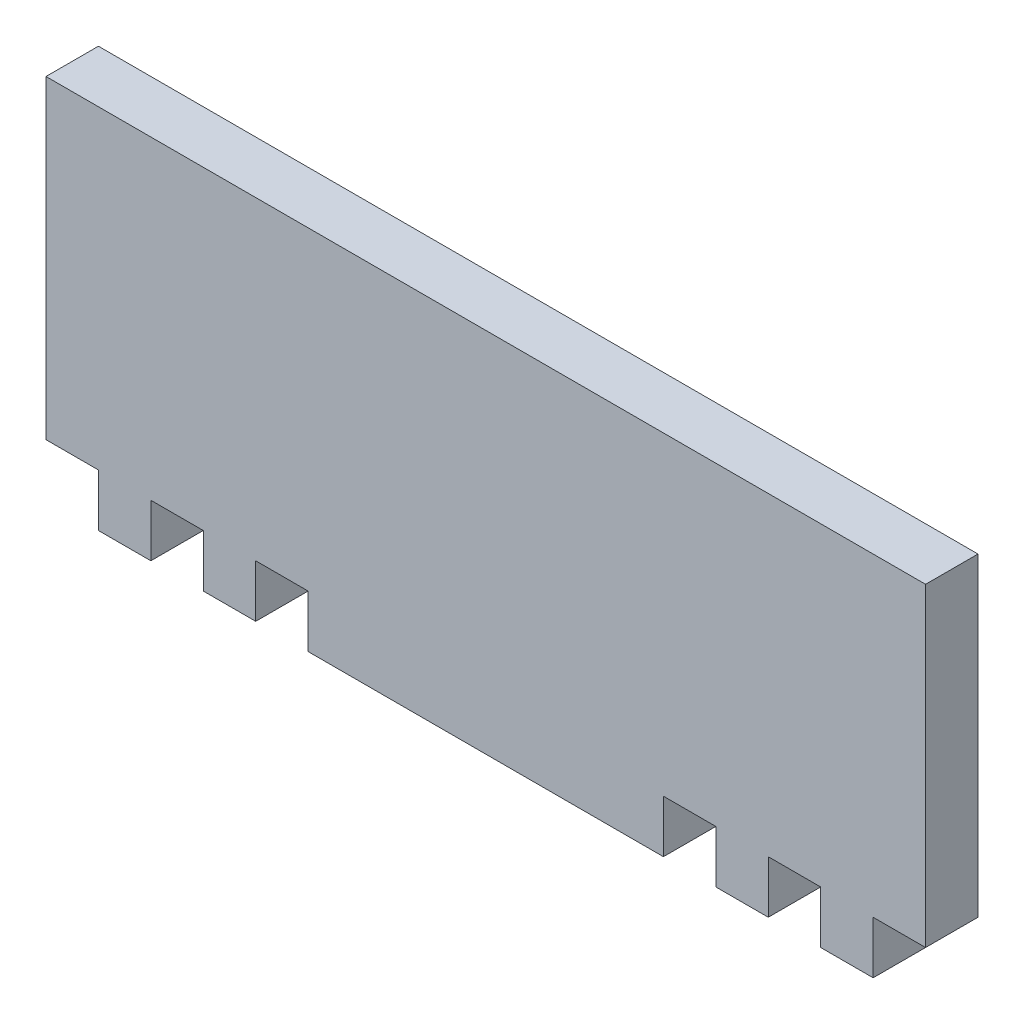
ISO-10303-21;
HEADER;
FILE_DESCRIPTION(('STEP AP214'),'2;1');
FILE_NAME('part.step','',(''),(''),'','','');
FILE_SCHEMA(('AUTOMOTIVE_DESIGN { 1 0 10303 214 1 1 1 1 }'));
ENDSEC;
DATA;
#1=APPLICATION_CONTEXT('core data for automotive mechanical design processes');
#2=APPLICATION_PROTOCOL_DEFINITION('international standard','automotive_design',2000,#1);
#3=PRODUCT_CONTEXT('',#1,'mechanical');
#4=PRODUCT('Part','Part','',(#3));
#5=PRODUCT_RELATED_PRODUCT_CATEGORY('part','',(#4));
#6=PRODUCT_DEFINITION_FORMATION('','',#4);
#7=PRODUCT_DEFINITION_CONTEXT('part definition',#1,'design');
#8=PRODUCT_DEFINITION('design','',#6,#7);
#9=PRODUCT_DEFINITION_SHAPE('','',#8);
#10=(LENGTH_UNIT() NAMED_UNIT(*) SI_UNIT(.MILLI.,.METRE.));
#11=(NAMED_UNIT(*) PLANE_ANGLE_UNIT() SI_UNIT($,.RADIAN.));
#12=(NAMED_UNIT(*) SI_UNIT($,.STERADIAN.) SOLID_ANGLE_UNIT());
#13=UNCERTAINTY_MEASURE_WITH_UNIT(LENGTH_MEASURE(1.E-05),#10,'distance_accuracy_value','');
#14=(GEOMETRIC_REPRESENTATION_CONTEXT(3) GLOBAL_UNCERTAINTY_ASSIGNED_CONTEXT((#13)) GLOBAL_UNIT_ASSIGNED_CONTEXT((#10,
#11,#12)) REPRESENTATION_CONTEXT('',''));
#15=CARTESIAN_POINT('',(0.,0.,0.));
#16=DIRECTION('',(0.,0.,1.));
#17=DIRECTION('',(1.,0.,0.));
#18=AXIS2_PLACEMENT_3D('',#15,#16,#17);
#19=CARTESIAN_POINT('',(-95.7657407799199,79.2291150803207,5.));
#20=DIRECTION('',(1.,0.,0.));
#21=DIRECTION('',(0.,0.,-1.));
#22=AXIS2_PLACEMENT_3D('',#19,#20,#21);
#23=PLANE('',#22);
#24=DIRECTION('',(0.,-1.,0.));
#25=VECTOR('',#24,1.);
#26=CARTESIAN_POINT('',(-95.7657407799199,79.2291150803207,0.));
#27=LINE('',#26,#25);
#28=CARTESIAN_POINT('',(-95.7657407799199,79.2291150803207,0.));
#29=VERTEX_POINT('',#28);
#30=CARTESIAN_POINT('',(-95.7657407799199,49.2291150803207,0.));
#31=VERTEX_POINT('',#30);
#32=EDGE_CURVE('E225',#29,#31,#27,.T.);
#33=ORIENTED_EDGE('',*,*,#32,.T.);
#34=DIRECTION('',(0.,0.,-1.));
#35=VECTOR('',#34,1.);
#36=CARTESIAN_POINT('',(-95.7657407799199,49.2291150803207,5.));
#37=LINE('',#36,#35);
#38=CARTESIAN_POINT('',(-95.7657407799199,49.2291150803207,5.));
#39=VERTEX_POINT('',#38);
#40=EDGE_CURVE('E11',#39,#31,#37,.T.);
#41=ORIENTED_EDGE('',*,*,#40,.F.);
#42=DIRECTION('',(0.,-1.,0.));
#43=VECTOR('',#42,1.);
#44=CARTESIAN_POINT('',(-95.7657407799199,79.2291150803207,5.));
#45=LINE('',#44,#43);
#46=CARTESIAN_POINT('',(-95.7657407799199,79.2291150803207,5.));
#47=VERTEX_POINT('',#46);
#48=EDGE_CURVE('E271',#47,#39,#45,.T.);
#49=ORIENTED_EDGE('',*,*,#48,.F.);
#50=DIRECTION('',(0.,0.,-1.));
#51=VECTOR('',#50,1.);
#52=CARTESIAN_POINT('',(-95.7657407799199,79.2291150803207,5.));
#53=LINE('',#52,#51);
#54=EDGE_CURVE('E221',#47,#29,#53,.T.);
#55=ORIENTED_EDGE('',*,*,#54,.T.);
#56=EDGE_LOOP('',(#33,#41,#49,#55));
#57=FACE_BOUND('',#56,.T.);
#58=ADVANCED_FACE('F33',(#57),#23,.F.);
#59=CARTESIAN_POINT('',(-95.7657407799199,49.2291150803207,5.));
#60=DIRECTION('',(0.,1.,0.));
#61=DIRECTION('',(0.,0.,1.));
#62=AXIS2_PLACEMENT_3D('',#59,#60,#61);
#63=PLANE('',#62);
#64=DIRECTION('',(1.,0.,0.));
#65=VECTOR('',#64,1.);
#66=CARTESIAN_POINT('',(-95.7657407799199,49.2291150803207,0.));
#67=LINE('',#66,#65);
#68=CARTESIAN_POINT('',(-90.7657407799199,49.2291150803207,0.));
#69=VERTEX_POINT('',#68);
#70=EDGE_CURVE('E228',#31,#69,#67,.T.);
#71=ORIENTED_EDGE('',*,*,#70,.T.);
#72=DIRECTION('',(0.,0.,-1.));
#73=VECTOR('',#72,1.);
#74=CARTESIAN_POINT('',(-90.7657407799199,49.2291150803207,5.));
#75=LINE('',#74,#73);
#76=CARTESIAN_POINT('',(-90.7657407799199,49.2291150803207,5.));
#77=VERTEX_POINT('',#76);
#78=EDGE_CURVE('E41',#77,#69,#75,.T.);
#79=ORIENTED_EDGE('',*,*,#78,.F.);
#80=DIRECTION('',(1.,0.,0.));
#81=VECTOR('',#80,1.);
#82=CARTESIAN_POINT('',(-95.7657407799199,49.2291150803207,5.));
#83=LINE('',#82,#81);
#84=EDGE_CURVE('E140',#39,#77,#83,.T.);
#85=ORIENTED_EDGE('',*,*,#84,.F.);
#86=ORIENTED_EDGE('',*,*,#40,.T.);
#87=EDGE_LOOP('',(#71,#79,#85,#86));
#88=FACE_BOUND('',#87,.T.);
#89=ADVANCED_FACE('F409',(#88),#63,.F.);
#90=CARTESIAN_POINT('',(-90.7657407799199,49.2291150803207,5.));
#91=DIRECTION('',(1.,0.,0.));
#92=DIRECTION('',(0.,0.,-1.));
#93=AXIS2_PLACEMENT_3D('',#90,#91,#92);
#94=PLANE('',#93);
#95=DIRECTION('',(0.,-1.,0.));
#96=VECTOR('',#95,1.);
#97=CARTESIAN_POINT('',(-90.7657407799199,49.2291150803207,0.));
#98=LINE('',#97,#96);
#99=CARTESIAN_POINT('',(-90.7657407799199,44.2291150803207,0.));
#100=VERTEX_POINT('',#99);
#101=EDGE_CURVE('E230',#69,#100,#98,.T.);
#102=ORIENTED_EDGE('',*,*,#101,.T.);
#103=DIRECTION('',(0.,0.,-1.));
#104=VECTOR('',#103,1.);
#105=CARTESIAN_POINT('',(-90.7657407799199,44.2291150803207,5.));
#106=LINE('',#105,#104);
#107=CARTESIAN_POINT('',(-90.7657407799199,44.2291150803207,5.));
#108=VERTEX_POINT('',#107);
#109=EDGE_CURVE('E326',#108,#100,#106,.T.);
#110=ORIENTED_EDGE('',*,*,#109,.F.);
#111=DIRECTION('',(0.,-1.,0.));
#112=VECTOR('',#111,1.);
#113=CARTESIAN_POINT('',(-90.7657407799199,49.2291150803207,5.));
#114=LINE('',#113,#112);
#115=EDGE_CURVE('E334',#77,#108,#114,.T.);
#116=ORIENTED_EDGE('',*,*,#115,.F.);
#117=ORIENTED_EDGE('',*,*,#78,.T.);
#118=EDGE_LOOP('',(#102,#110,#116,#117));
#119=FACE_BOUND('',#118,.T.);
#120=ADVANCED_FACE('F332',(#119),#94,.F.);
#121=CARTESIAN_POINT('',(-90.7657407799199,44.2291150803207,5.));
#122=DIRECTION('',(0.,1.,0.));
#123=DIRECTION('',(0.,0.,1.));
#124=AXIS2_PLACEMENT_3D('',#121,#122,#123);
#125=PLANE('',#124);
#126=DIRECTION('',(1.,0.,0.));
#127=VECTOR('',#126,1.);
#128=CARTESIAN_POINT('',(-90.7657407799199,44.2291150803207,0.));
#129=LINE('',#128,#127);
#130=CARTESIAN_POINT('',(-85.7657407799199,44.2291150803207,0.));
#131=VERTEX_POINT('',#130);
#132=EDGE_CURVE('E232',#100,#131,#129,.T.);
#133=ORIENTED_EDGE('',*,*,#132,.T.);
#134=DIRECTION('',(0.,0.,-1.));
#135=VECTOR('',#134,1.);
#136=CARTESIAN_POINT('',(-85.7657407799199,44.2291150803207,5.));
#137=LINE('',#136,#135);
#138=CARTESIAN_POINT('',(-85.7657407799199,44.2291150803207,5.));
#139=VERTEX_POINT('',#138);
#140=EDGE_CURVE('E323',#139,#131,#137,.T.);
#141=ORIENTED_EDGE('',*,*,#140,.F.);
#142=DIRECTION('',(1.,0.,0.));
#143=VECTOR('',#142,1.);
#144=CARTESIAN_POINT('',(-90.7657407799199,44.2291150803207,5.));
#145=LINE('',#144,#143);
#146=EDGE_CURVE('E352',#108,#139,#145,.T.);
#147=ORIENTED_EDGE('',*,*,#146,.F.);
#148=ORIENTED_EDGE('',*,*,#109,.T.);
#149=EDGE_LOOP('',(#133,#141,#147,#148));
#150=FACE_BOUND('',#149,.T.);
#151=ADVANCED_FACE('F343',(#150),#125,.F.);
#152=CARTESIAN_POINT('',(-85.7657407799199,44.2291150803207,5.));
#153=DIRECTION('',(-1.,0.,0.));
#154=DIRECTION('',(0.,0.,1.));
#155=AXIS2_PLACEMENT_3D('',#152,#153,#154);
#156=PLANE('',#155);
#157=DIRECTION('',(0.,1.,0.));
#158=VECTOR('',#157,1.);
#159=CARTESIAN_POINT('',(-85.7657407799199,44.2291150803207,0.));
#160=LINE('',#159,#158);
#161=CARTESIAN_POINT('',(-85.7657407799199,49.2291150803207,0.));
#162=VERTEX_POINT('',#161);
#163=EDGE_CURVE('E234',#131,#162,#160,.T.);
#164=ORIENTED_EDGE('',*,*,#163,.T.);
#165=DIRECTION('',(0.,0.,-1.));
#166=VECTOR('',#165,1.);
#167=CARTESIAN_POINT('',(-85.7657407799199,49.2291150803207,5.));
#168=LINE('',#167,#166);
#169=CARTESIAN_POINT('',(-85.7657407799199,49.2291150803207,5.));
#170=VERTEX_POINT('',#169);
#171=EDGE_CURVE('E320',#170,#162,#168,.T.);
#172=ORIENTED_EDGE('',*,*,#171,.F.);
#173=DIRECTION('',(0.,1.,0.));
#174=VECTOR('',#173,1.);
#175=CARTESIAN_POINT('',(-85.7657407799199,44.2291150803207,5.));
#176=LINE('',#175,#174);
#177=EDGE_CURVE('E349',#139,#170,#176,.T.);
#178=ORIENTED_EDGE('',*,*,#177,.F.);
#179=ORIENTED_EDGE('',*,*,#140,.T.);
#180=EDGE_LOOP('',(#164,#172,#178,#179));
#181=FACE_BOUND('',#180,.T.);
#182=ADVANCED_FACE('F347',(#181),#156,.F.);
#183=CARTESIAN_POINT('',(-85.7657407799199,49.2291150803207,5.));
#184=DIRECTION('',(0.,1.,0.));
#185=DIRECTION('',(0.,0.,1.));
#186=AXIS2_PLACEMENT_3D('',#183,#184,#185);
#187=PLANE('',#186);
#188=DIRECTION('',(1.,0.,0.));
#189=VECTOR('',#188,1.);
#190=CARTESIAN_POINT('',(-85.7657407799199,49.2291150803207,0.));
#191=LINE('',#190,#189);
#192=CARTESIAN_POINT('',(-80.7657407799199,49.2291150803207,0.));
#193=VERTEX_POINT('',#192);
#194=EDGE_CURVE('E236',#162,#193,#191,.T.);
#195=ORIENTED_EDGE('',*,*,#194,.T.);
#196=DIRECTION('',(0.,0.,-1.));
#197=VECTOR('',#196,1.);
#198=CARTESIAN_POINT('',(-80.7657407799199,49.2291150803207,5.));
#199=LINE('',#198,#197);
#200=CARTESIAN_POINT('',(-80.7657407799199,49.2291150803207,5.));
#201=VERTEX_POINT('',#200);
#202=EDGE_CURVE('E317',#201,#193,#199,.T.);
#203=ORIENTED_EDGE('',*,*,#202,.F.);
#204=DIRECTION('',(1.,0.,0.));
#205=VECTOR('',#204,1.);
#206=CARTESIAN_POINT('',(-85.7657407799199,49.2291150803207,5.));
#207=LINE('',#206,#205);
#208=EDGE_CURVE('E351',#170,#201,#207,.T.);
#209=ORIENTED_EDGE('',*,*,#208,.F.);
#210=ORIENTED_EDGE('',*,*,#171,.T.);
#211=EDGE_LOOP('',(#195,#203,#209,#210));
#212=FACE_BOUND('',#211,.T.);
#213=ADVANCED_FACE('F422',(#212),#187,.F.);
#214=CARTESIAN_POINT('',(-80.7657407799199,49.2291150803207,5.));
#215=DIRECTION('',(1.,0.,0.));
#216=DIRECTION('',(0.,0.,-1.));
#217=AXIS2_PLACEMENT_3D('',#214,#215,#216);
#218=PLANE('',#217);
#219=DIRECTION('',(0.,-1.,0.));
#220=VECTOR('',#219,1.);
#221=CARTESIAN_POINT('',(-80.7657407799199,49.2291150803207,0.));
#222=LINE('',#221,#220);
#223=CARTESIAN_POINT('',(-80.7657407799199,44.2291150803207,0.));
#224=VERTEX_POINT('',#223);
#225=EDGE_CURVE('E238',#193,#224,#222,.T.);
#226=ORIENTED_EDGE('',*,*,#225,.T.);
#227=DIRECTION('',(0.,0.,-1.));
#228=VECTOR('',#227,1.);
#229=CARTESIAN_POINT('',(-80.7657407799199,44.2291150803207,5.));
#230=LINE('',#229,#228);
#231=CARTESIAN_POINT('',(-80.7657407799199,44.2291150803207,5.));
#232=VERTEX_POINT('',#231);
#233=EDGE_CURVE('E314',#232,#224,#230,.T.);
#234=ORIENTED_EDGE('',*,*,#233,.F.);
#235=DIRECTION('',(0.,-1.,0.));
#236=VECTOR('',#235,1.);
#237=CARTESIAN_POINT('',(-80.7657407799199,49.2291150803207,5.));
#238=LINE('',#237,#236);
#239=EDGE_CURVE('E354',#201,#232,#238,.T.);
#240=ORIENTED_EDGE('',*,*,#239,.F.);
#241=ORIENTED_EDGE('',*,*,#202,.T.);
#242=EDGE_LOOP('',(#226,#234,#240,#241));
#243=FACE_BOUND('',#242,.T.);
#244=ADVANCED_FACE('F425',(#243),#218,.F.);
#245=CARTESIAN_POINT('',(-80.7657407799199,44.2291150803207,5.));
#246=DIRECTION('',(0.,1.,0.));
#247=DIRECTION('',(0.,0.,1.));
#248=AXIS2_PLACEMENT_3D('',#245,#246,#247);
#249=PLANE('',#248);
#250=DIRECTION('',(1.,0.,0.));
#251=VECTOR('',#250,1.);
#252=CARTESIAN_POINT('',(-80.7657407799199,44.2291150803207,0.));
#253=LINE('',#252,#251);
#254=CARTESIAN_POINT('',(-75.7657407799199,44.2291150803207,0.));
#255=VERTEX_POINT('',#254);
#256=EDGE_CURVE('E240',#224,#255,#253,.T.);
#257=ORIENTED_EDGE('',*,*,#256,.T.);
#258=DIRECTION('',(0.,0.,-1.));
#259=VECTOR('',#258,1.);
#260=CARTESIAN_POINT('',(-75.7657407799199,44.2291150803207,5.));
#261=LINE('',#260,#259);
#262=CARTESIAN_POINT('',(-75.7657407799199,44.2291150803207,5.));
#263=VERTEX_POINT('',#262);
#264=EDGE_CURVE('E311',#263,#255,#261,.T.);
#265=ORIENTED_EDGE('',*,*,#264,.F.);
#266=DIRECTION('',(1.,0.,0.));
#267=VECTOR('',#266,1.);
#268=CARTESIAN_POINT('',(-80.7657407799199,44.2291150803207,5.));
#269=LINE('',#268,#267);
#270=EDGE_CURVE('E360',#232,#263,#269,.T.);
#271=ORIENTED_EDGE('',*,*,#270,.F.);
#272=ORIENTED_EDGE('',*,*,#233,.T.);
#273=EDGE_LOOP('',(#257,#265,#271,#272));
#274=FACE_BOUND('',#273,.T.);
#275=ADVANCED_FACE('F429',(#274),#249,.F.);
#276=CARTESIAN_POINT('',(-75.7657407799199,44.2291150803207,5.));
#277=DIRECTION('',(-1.,0.,0.));
#278=DIRECTION('',(0.,0.,1.));
#279=AXIS2_PLACEMENT_3D('',#276,#277,#278);
#280=PLANE('',#279);
#281=DIRECTION('',(0.,1.,0.));
#282=VECTOR('',#281,1.);
#283=CARTESIAN_POINT('',(-75.7657407799199,44.2291150803207,0.));
#284=LINE('',#283,#282);
#285=CARTESIAN_POINT('',(-75.7657407799199,49.2291150803207,0.));
#286=VERTEX_POINT('',#285);
#287=EDGE_CURVE('E242',#255,#286,#284,.T.);
#288=ORIENTED_EDGE('',*,*,#287,.T.);
#289=DIRECTION('',(0.,0.,-1.));
#290=VECTOR('',#289,1.);
#291=CARTESIAN_POINT('',(-75.7657407799199,49.2291150803207,5.));
#292=LINE('',#291,#290);
#293=CARTESIAN_POINT('',(-75.7657407799199,49.2291150803207,5.));
#294=VERTEX_POINT('',#293);
#295=EDGE_CURVE('E308',#294,#286,#292,.T.);
#296=ORIENTED_EDGE('',*,*,#295,.F.);
#297=DIRECTION('',(0.,1.,0.));
#298=VECTOR('',#297,1.);
#299=CARTESIAN_POINT('',(-75.7657407799199,44.2291150803207,5.));
#300=LINE('',#299,#298);
#301=EDGE_CURVE('E362',#263,#294,#300,.T.);
#302=ORIENTED_EDGE('',*,*,#301,.F.);
#303=ORIENTED_EDGE('',*,*,#264,.T.);
#304=EDGE_LOOP('',(#288,#296,#302,#303));
#305=FACE_BOUND('',#304,.T.);
#306=ADVANCED_FACE('F433',(#305),#280,.F.);
#307=CARTESIAN_POINT('',(-75.7657407799199,49.2291150803207,5.));
#308=DIRECTION('',(0.,1.,0.));
#309=DIRECTION('',(0.,0.,1.));
#310=AXIS2_PLACEMENT_3D('',#307,#308,#309);
#311=PLANE('',#310);
#312=DIRECTION('',(1.,0.,0.));
#313=VECTOR('',#312,1.);
#314=CARTESIAN_POINT('',(-75.7657407799199,49.2291150803207,0.));
#315=LINE('',#314,#313);
#316=CARTESIAN_POINT('',(-70.7657407799199,49.2291150803207,0.));
#317=VERTEX_POINT('',#316);
#318=EDGE_CURVE('E244',#286,#317,#315,.T.);
#319=ORIENTED_EDGE('',*,*,#318,.T.);
#320=DIRECTION('',(0.,0.,-1.));
#321=VECTOR('',#320,1.);
#322=CARTESIAN_POINT('',(-70.7657407799199,49.2291150803207,5.));
#323=LINE('',#322,#321);
#324=CARTESIAN_POINT('',(-70.7657407799199,49.2291150803207,5.));
#325=VERTEX_POINT('',#324);
#326=EDGE_CURVE('E305',#325,#317,#323,.T.);
#327=ORIENTED_EDGE('',*,*,#326,.F.);
#328=DIRECTION('',(1.,0.,0.));
#329=VECTOR('',#328,1.);
#330=CARTESIAN_POINT('',(-75.7657407799199,49.2291150803207,5.));
#331=LINE('',#330,#329);
#332=EDGE_CURVE('E364',#294,#325,#331,.T.);
#333=ORIENTED_EDGE('',*,*,#332,.F.);
#334=ORIENTED_EDGE('',*,*,#295,.T.);
#335=EDGE_LOOP('',(#319,#327,#333,#334));
#336=FACE_BOUND('',#335,.T.);
#337=ADVANCED_FACE('F437',(#336),#311,.F.);
#338=CARTESIAN_POINT('',(-70.7657407799199,49.2291150803207,5.));
#339=DIRECTION('',(1.,0.,0.));
#340=DIRECTION('',(0.,0.,-1.));
#341=AXIS2_PLACEMENT_3D('',#338,#339,#340);
#342=PLANE('',#341);
#343=DIRECTION('',(0.,-1.,0.));
#344=VECTOR('',#343,1.);
#345=CARTESIAN_POINT('',(-70.7657407799199,49.2291150803207,0.));
#346=LINE('',#345,#344);
#347=CARTESIAN_POINT('',(-70.7657407799199,44.2291150803207,0.));
#348=VERTEX_POINT('',#347);
#349=EDGE_CURVE('E246',#317,#348,#346,.T.);
#350=ORIENTED_EDGE('',*,*,#349,.T.);
#351=DIRECTION('',(0.,0.,-1.));
#352=VECTOR('',#351,1.);
#353=CARTESIAN_POINT('',(-70.7657407799199,44.2291150803207,5.));
#354=LINE('',#353,#352);
#355=CARTESIAN_POINT('',(-70.7657407799199,44.2291150803207,5.));
#356=VERTEX_POINT('',#355);
#357=EDGE_CURVE('E302',#356,#348,#354,.T.);
#358=ORIENTED_EDGE('',*,*,#357,.F.);
#359=DIRECTION('',(0.,-1.,0.));
#360=VECTOR('',#359,1.);
#361=CARTESIAN_POINT('',(-70.7657407799199,49.2291150803207,5.));
#362=LINE('',#361,#360);
#363=EDGE_CURVE('E366',#325,#356,#362,.T.);
#364=ORIENTED_EDGE('',*,*,#363,.F.);
#365=ORIENTED_EDGE('',*,*,#326,.T.);
#366=EDGE_LOOP('',(#350,#358,#364,#365));
#367=FACE_BOUND('',#366,.T.);
#368=ADVANCED_FACE('F441',(#367),#342,.F.);
#369=CARTESIAN_POINT('',(-70.7657407799199,44.2291150803207,5.));
#370=DIRECTION('',(0.,1.,0.));
#371=DIRECTION('',(0.,0.,1.));
#372=AXIS2_PLACEMENT_3D('',#369,#370,#371);
#373=PLANE('',#372);
#374=DIRECTION('',(1.,0.,0.));
#375=VECTOR('',#374,1.);
#376=CARTESIAN_POINT('',(-70.7657407799199,44.2291150803207,0.));
#377=LINE('',#376,#375);
#378=CARTESIAN_POINT('',(-36.8847303982135,44.2291150803207,0.));
#379=VERTEX_POINT('',#378);
#380=EDGE_CURVE('E248',#348,#379,#377,.T.);
#381=ORIENTED_EDGE('',*,*,#380,.T.);
#382=DIRECTION('',(0.,0.,-1.));
#383=VECTOR('',#382,1.);
#384=CARTESIAN_POINT('',(-36.8847303982135,44.2291150803207,5.));
#385=LINE('',#384,#383);
#386=CARTESIAN_POINT('',(-36.8847303982135,44.2291150803207,5.));
#387=VERTEX_POINT('',#386);
#388=EDGE_CURVE('E299',#387,#379,#385,.T.);
#389=ORIENTED_EDGE('',*,*,#388,.F.);
#390=DIRECTION('',(1.,0.,0.));
#391=VECTOR('',#390,1.);
#392=CARTESIAN_POINT('',(-70.7657407799199,44.2291150803207,5.));
#393=LINE('',#392,#391);
#394=EDGE_CURVE('E368',#356,#387,#393,.T.);
#395=ORIENTED_EDGE('',*,*,#394,.F.);
#396=ORIENTED_EDGE('',*,*,#357,.T.);
#397=EDGE_LOOP('',(#381,#389,#395,#396));
#398=FACE_BOUND('',#397,.T.);
#399=ADVANCED_FACE('F445',(#398),#373,.F.);
#400=CARTESIAN_POINT('',(-36.8847303982135,44.2291150803207,5.));
#401=DIRECTION('',(-1.,0.,0.));
#402=DIRECTION('',(0.,0.,1.));
#403=AXIS2_PLACEMENT_3D('',#400,#401,#402);
#404=PLANE('',#403);
#405=DIRECTION('',(0.,1.,0.));
#406=VECTOR('',#405,1.);
#407=CARTESIAN_POINT('',(-36.8847303982135,44.2291150803207,0.));
#408=LINE('',#407,#406);
#409=CARTESIAN_POINT('',(-36.8847303982135,49.2291150803207,0.));
#410=VERTEX_POINT('',#409);
#411=EDGE_CURVE('E250',#379,#410,#408,.T.);
#412=ORIENTED_EDGE('',*,*,#411,.T.);
#413=DIRECTION('',(0.,0.,-1.));
#414=VECTOR('',#413,1.);
#415=CARTESIAN_POINT('',(-36.8847303982135,49.2291150803207,5.));
#416=LINE('',#415,#414);
#417=CARTESIAN_POINT('',(-36.8847303982135,49.2291150803207,5.));
#418=VERTEX_POINT('',#417);
#419=EDGE_CURVE('E296',#418,#410,#416,.T.);
#420=ORIENTED_EDGE('',*,*,#419,.F.);
#421=DIRECTION('',(0.,1.,0.));
#422=VECTOR('',#421,1.);
#423=CARTESIAN_POINT('',(-36.8847303982135,44.2291150803207,5.));
#424=LINE('',#423,#422);
#425=EDGE_CURVE('E370',#387,#418,#424,.T.);
#426=ORIENTED_EDGE('',*,*,#425,.F.);
#427=ORIENTED_EDGE('',*,*,#388,.T.);
#428=EDGE_LOOP('',(#412,#420,#426,#427));
#429=FACE_BOUND('',#428,.T.);
#430=ADVANCED_FACE('F449',(#429),#404,.F.);
#431=CARTESIAN_POINT('',(-36.8847303982135,49.2291150803207,5.));
#432=DIRECTION('',(0.,1.,0.));
#433=DIRECTION('',(0.,0.,1.));
#434=AXIS2_PLACEMENT_3D('',#431,#432,#433);
#435=PLANE('',#434);
#436=DIRECTION('',(1.,0.,0.));
#437=VECTOR('',#436,1.);
#438=CARTESIAN_POINT('',(-36.8847303982135,49.2291150803207,0.));
#439=LINE('',#438,#437);
#440=CARTESIAN_POINT('',(-31.8847303982135,49.2291150803207,0.));
#441=VERTEX_POINT('',#440);
#442=EDGE_CURVE('E252',#410,#441,#439,.T.);
#443=ORIENTED_EDGE('',*,*,#442,.T.);
#444=DIRECTION('',(0.,0.,-1.));
#445=VECTOR('',#444,1.);
#446=CARTESIAN_POINT('',(-31.8847303982135,49.2291150803207,5.));
#447=LINE('',#446,#445);
#448=CARTESIAN_POINT('',(-31.8847303982135,49.2291150803207,5.));
#449=VERTEX_POINT('',#448);
#450=EDGE_CURVE('E293',#449,#441,#447,.T.);
#451=ORIENTED_EDGE('',*,*,#450,.F.);
#452=DIRECTION('',(1.,0.,0.));
#453=VECTOR('',#452,1.);
#454=CARTESIAN_POINT('',(-36.8847303982135,49.2291150803207,5.));
#455=LINE('',#454,#453);
#456=EDGE_CURVE('E372',#418,#449,#455,.T.);
#457=ORIENTED_EDGE('',*,*,#456,.F.);
#458=ORIENTED_EDGE('',*,*,#419,.T.);
#459=EDGE_LOOP('',(#443,#451,#457,#458));
#460=FACE_BOUND('',#459,.T.);
#461=ADVANCED_FACE('F453',(#460),#435,.F.);
#462=CARTESIAN_POINT('',(-31.8847303982135,49.2291150803207,5.));
#463=DIRECTION('',(1.,0.,0.));
#464=DIRECTION('',(0.,0.,-1.));
#465=AXIS2_PLACEMENT_3D('',#462,#463,#464);
#466=PLANE('',#465);
#467=DIRECTION('',(0.,-1.,0.));
#468=VECTOR('',#467,1.);
#469=CARTESIAN_POINT('',(-31.8847303982135,49.2291150803207,0.));
#470=LINE('',#469,#468);
#471=CARTESIAN_POINT('',(-31.8847303982135,44.2291150803207,0.));
#472=VERTEX_POINT('',#471);
#473=EDGE_CURVE('E254',#441,#472,#470,.T.);
#474=ORIENTED_EDGE('',*,*,#473,.T.);
#475=DIRECTION('',(0.,0.,-1.));
#476=VECTOR('',#475,1.);
#477=CARTESIAN_POINT('',(-31.8847303982135,44.2291150803207,5.));
#478=LINE('',#477,#476);
#479=CARTESIAN_POINT('',(-31.8847303982135,44.2291150803207,5.));
#480=VERTEX_POINT('',#479);
#481=EDGE_CURVE('E290',#480,#472,#478,.T.);
#482=ORIENTED_EDGE('',*,*,#481,.F.);
#483=DIRECTION('',(0.,-1.,0.));
#484=VECTOR('',#483,1.);
#485=CARTESIAN_POINT('',(-31.8847303982135,49.2291150803207,5.));
#486=LINE('',#485,#484);
#487=EDGE_CURVE('E374',#449,#480,#486,.T.);
#488=ORIENTED_EDGE('',*,*,#487,.F.);
#489=ORIENTED_EDGE('',*,*,#450,.T.);
#490=EDGE_LOOP('',(#474,#482,#488,#489));
#491=FACE_BOUND('',#490,.T.);
#492=ADVANCED_FACE('F457',(#491),#466,.F.);
#493=CARTESIAN_POINT('',(-31.8847303982135,44.2291150803207,5.));
#494=DIRECTION('',(0.,1.,0.));
#495=DIRECTION('',(0.,0.,1.));
#496=AXIS2_PLACEMENT_3D('',#493,#494,#495);
#497=PLANE('',#496);
#498=DIRECTION('',(1.,0.,0.));
#499=VECTOR('',#498,1.);
#500=CARTESIAN_POINT('',(-31.8847303982135,44.2291150803207,0.));
#501=LINE('',#500,#499);
#502=CARTESIAN_POINT('',(-26.8847303982135,44.2291150803207,0.));
#503=VERTEX_POINT('',#502);
#504=EDGE_CURVE('E256',#472,#503,#501,.T.);
#505=ORIENTED_EDGE('',*,*,#504,.T.);
#506=DIRECTION('',(0.,0.,-1.));
#507=VECTOR('',#506,1.);
#508=CARTESIAN_POINT('',(-26.8847303982135,44.2291150803207,5.));
#509=LINE('',#508,#507);
#510=CARTESIAN_POINT('',(-26.8847303982135,44.2291150803207,5.));
#511=VERTEX_POINT('',#510);
#512=EDGE_CURVE('E287',#511,#503,#509,.T.);
#513=ORIENTED_EDGE('',*,*,#512,.F.);
#514=DIRECTION('',(1.,0.,0.));
#515=VECTOR('',#514,1.);
#516=CARTESIAN_POINT('',(-31.8847303982135,44.2291150803207,5.));
#517=LINE('',#516,#515);
#518=EDGE_CURVE('E376',#480,#511,#517,.T.);
#519=ORIENTED_EDGE('',*,*,#518,.F.);
#520=ORIENTED_EDGE('',*,*,#481,.T.);
#521=EDGE_LOOP('',(#505,#513,#519,#520));
#522=FACE_BOUND('',#521,.T.);
#523=ADVANCED_FACE('F461',(#522),#497,.F.);
#524=CARTESIAN_POINT('',(-26.8847303982135,44.2291150803207,5.));
#525=DIRECTION('',(-1.,0.,0.));
#526=DIRECTION('',(0.,0.,1.));
#527=AXIS2_PLACEMENT_3D('',#524,#525,#526);
#528=PLANE('',#527);
#529=DIRECTION('',(0.,1.,0.));
#530=VECTOR('',#529,1.);
#531=CARTESIAN_POINT('',(-26.8847303982135,44.2291150803207,0.));
#532=LINE('',#531,#530);
#533=CARTESIAN_POINT('',(-26.8847303982135,49.2291150803207,0.));
#534=VERTEX_POINT('',#533);
#535=EDGE_CURVE('E258',#503,#534,#532,.T.);
#536=ORIENTED_EDGE('',*,*,#535,.T.);
#537=DIRECTION('',(0.,0.,-1.));
#538=VECTOR('',#537,1.);
#539=CARTESIAN_POINT('',(-26.8847303982135,49.2291150803207,5.));
#540=LINE('',#539,#538);
#541=CARTESIAN_POINT('',(-26.8847303982135,49.2291150803207,5.));
#542=VERTEX_POINT('',#541);
#543=EDGE_CURVE('E284',#542,#534,#540,.T.);
#544=ORIENTED_EDGE('',*,*,#543,.F.);
#545=DIRECTION('',(0.,1.,0.));
#546=VECTOR('',#545,1.);
#547=CARTESIAN_POINT('',(-26.8847303982135,44.2291150803207,5.));
#548=LINE('',#547,#546);
#549=EDGE_CURVE('E378',#511,#542,#548,.T.);
#550=ORIENTED_EDGE('',*,*,#549,.F.);
#551=ORIENTED_EDGE('',*,*,#512,.T.);
#552=EDGE_LOOP('',(#536,#544,#550,#551));
#553=FACE_BOUND('',#552,.T.);
#554=ADVANCED_FACE('F465',(#553),#528,.F.);
#555=CARTESIAN_POINT('',(-26.8847303982135,49.2291150803207,5.));
#556=DIRECTION('',(0.,1.,0.));
#557=DIRECTION('',(0.,0.,1.));
#558=AXIS2_PLACEMENT_3D('',#555,#556,#557);
#559=PLANE('',#558);
#560=DIRECTION('',(1.,0.,0.));
#561=VECTOR('',#560,1.);
#562=CARTESIAN_POINT('',(-26.8847303982135,49.2291150803207,0.));
#563=LINE('',#562,#561);
#564=CARTESIAN_POINT('',(-21.8847303982135,49.2291150803207,0.));
#565=VERTEX_POINT('',#564);
#566=EDGE_CURVE('E260',#534,#565,#563,.T.);
#567=ORIENTED_EDGE('',*,*,#566,.T.);
#568=DIRECTION('',(0.,0.,-1.));
#569=VECTOR('',#568,1.);
#570=CARTESIAN_POINT('',(-21.8847303982135,49.2291150803207,5.));
#571=LINE('',#570,#569);
#572=CARTESIAN_POINT('',(-21.8847303982135,49.2291150803207,5.));
#573=VERTEX_POINT('',#572);
#574=EDGE_CURVE('E281',#573,#565,#571,.T.);
#575=ORIENTED_EDGE('',*,*,#574,.F.);
#576=DIRECTION('',(1.,0.,0.));
#577=VECTOR('',#576,1.);
#578=CARTESIAN_POINT('',(-26.8847303982135,49.2291150803207,5.));
#579=LINE('',#578,#577);
#580=EDGE_CURVE('E380',#542,#573,#579,.T.);
#581=ORIENTED_EDGE('',*,*,#580,.F.);
#582=ORIENTED_EDGE('',*,*,#543,.T.);
#583=EDGE_LOOP('',(#567,#575,#581,#582));
#584=FACE_BOUND('',#583,.T.);
#585=ADVANCED_FACE('F469',(#584),#559,.F.);
#586=CARTESIAN_POINT('',(-21.8847303982135,49.2291150803207,5.));
#587=DIRECTION('',(1.,0.,0.));
#588=DIRECTION('',(0.,0.,-1.));
#589=AXIS2_PLACEMENT_3D('',#586,#587,#588);
#590=PLANE('',#589);
#591=DIRECTION('',(0.,-1.,0.));
#592=VECTOR('',#591,1.);
#593=CARTESIAN_POINT('',(-21.8847303982135,49.2291150803207,0.));
#594=LINE('',#593,#592);
#595=CARTESIAN_POINT('',(-21.8847303982135,44.2291150803207,0.));
#596=VERTEX_POINT('',#595);
#597=EDGE_CURVE('E262',#565,#596,#594,.T.);
#598=ORIENTED_EDGE('',*,*,#597,.T.);
#599=DIRECTION('',(0.,0.,-1.));
#600=VECTOR('',#599,1.);
#601=CARTESIAN_POINT('',(-21.8847303982135,44.2291150803207,5.));
#602=LINE('',#601,#600);
#603=CARTESIAN_POINT('',(-21.8847303982135,44.2291150803207,5.));
#604=VERTEX_POINT('',#603);
#605=EDGE_CURVE('E278',#604,#596,#602,.T.);
#606=ORIENTED_EDGE('',*,*,#605,.F.);
#607=DIRECTION('',(0.,-1.,0.));
#608=VECTOR('',#607,1.);
#609=CARTESIAN_POINT('',(-21.8847303982135,49.2291150803207,5.));
#610=LINE('',#609,#608);
#611=EDGE_CURVE('E382',#573,#604,#610,.T.);
#612=ORIENTED_EDGE('',*,*,#611,.F.);
#613=ORIENTED_EDGE('',*,*,#574,.T.);
#614=EDGE_LOOP('',(#598,#606,#612,#613));
#615=FACE_BOUND('',#614,.T.);
#616=ADVANCED_FACE('F473',(#615),#590,.F.);
#617=CARTESIAN_POINT('',(-21.8847303982135,44.2291150803207,5.));
#618=DIRECTION('',(0.,1.,0.));
#619=DIRECTION('',(0.,0.,1.));
#620=AXIS2_PLACEMENT_3D('',#617,#618,#619);
#621=PLANE('',#620);
#622=DIRECTION('',(1.,0.,0.));
#623=VECTOR('',#622,1.);
#624=CARTESIAN_POINT('',(-21.8847303982135,44.2291150803207,0.));
#625=LINE('',#624,#623);
#626=CARTESIAN_POINT('',(-16.8847303982135,44.2291150803207,0.));
#627=VERTEX_POINT('',#626);
#628=EDGE_CURVE('E264',#596,#627,#625,.T.);
#629=ORIENTED_EDGE('',*,*,#628,.T.);
#630=DIRECTION('',(0.,0.,-1.));
#631=VECTOR('',#630,1.);
#632=CARTESIAN_POINT('',(-16.8847303982135,44.2291150803207,5.));
#633=LINE('',#632,#631);
#634=CARTESIAN_POINT('',(-16.8847303982135,44.2291150803207,5.));
#635=VERTEX_POINT('',#634);
#636=EDGE_CURVE('E275',#635,#627,#633,.T.);
#637=ORIENTED_EDGE('',*,*,#636,.F.);
#638=DIRECTION('',(1.,0.,0.));
#639=VECTOR('',#638,1.);
#640=CARTESIAN_POINT('',(-21.8847303982135,44.2291150803207,5.));
#641=LINE('',#640,#639);
#642=EDGE_CURVE('E384',#604,#635,#641,.T.);
#643=ORIENTED_EDGE('',*,*,#642,.F.);
#644=ORIENTED_EDGE('',*,*,#605,.T.);
#645=EDGE_LOOP('',(#629,#637,#643,#644));
#646=FACE_BOUND('',#645,.T.);
#647=ADVANCED_FACE('F390',(#646),#621,.F.);
#648=CARTESIAN_POINT('',(-16.8847303982135,44.2291150803207,5.));
#649=DIRECTION('',(-1.,0.,0.));
#650=DIRECTION('',(0.,0.,1.));
#651=AXIS2_PLACEMENT_3D('',#648,#649,#650);
#652=PLANE('',#651);
#653=DIRECTION('',(0.,1.,0.));
#654=VECTOR('',#653,1.);
#655=CARTESIAN_POINT('',(-16.8847303982135,44.2291150803207,0.));
#656=LINE('',#655,#654);
#657=CARTESIAN_POINT('',(-16.8847303982135,49.2291150803207,0.));
#658=VERTEX_POINT('',#657);
#659=EDGE_CURVE('E266',#627,#658,#656,.T.);
#660=ORIENTED_EDGE('',*,*,#659,.T.);
#661=DIRECTION('',(0.,0.,-1.));
#662=VECTOR('',#661,1.);
#663=CARTESIAN_POINT('',(-16.8847303982135,49.2291150803207,5.));
#664=LINE('',#663,#662);
#665=CARTESIAN_POINT('',(-16.8847303982135,49.2291150803207,5.));
#666=VERTEX_POINT('',#665);
#667=EDGE_CURVE('E216',#666,#658,#664,.T.);
#668=ORIENTED_EDGE('',*,*,#667,.F.);
#669=DIRECTION('',(0.,1.,0.));
#670=VECTOR('',#669,1.);
#671=CARTESIAN_POINT('',(-16.8847303982135,44.2291150803207,5.));
#672=LINE('',#671,#670);
#673=EDGE_CURVE('E207',#635,#666,#672,.T.);
#674=ORIENTED_EDGE('',*,*,#673,.F.);
#675=ORIENTED_EDGE('',*,*,#636,.T.);
#676=EDGE_LOOP('',(#660,#668,#674,#675));
#677=FACE_BOUND('',#676,.T.);
#678=ADVANCED_FACE('F394',(#677),#652,.F.);
#679=CARTESIAN_POINT('',(-16.8847303982135,49.2291150803207,5.));
#680=DIRECTION('',(0.,1.,0.));
#681=DIRECTION('',(0.,0.,1.));
#682=AXIS2_PLACEMENT_3D('',#679,#680,#681);
#683=PLANE('',#682);
#684=DIRECTION('',(1.,0.,0.));
#685=VECTOR('',#684,1.);
#686=CARTESIAN_POINT('',(-16.8847303982135,49.2291150803207,0.));
#687=LINE('',#686,#685);
#688=CARTESIAN_POINT('',(-11.8847303982135,49.2291150803207,0.));
#689=VERTEX_POINT('',#688);
#690=EDGE_CURVE('E215',#658,#689,#687,.T.);
#691=ORIENTED_EDGE('',*,*,#690,.T.);
#692=DIRECTION('',(0.,0.,-1.));
#693=VECTOR('',#692,1.);
#694=CARTESIAN_POINT('',(-11.8847303982135,49.2291150803207,5.));
#695=LINE('',#694,#693);
#696=CARTESIAN_POINT('',(-11.8847303982135,49.2291150803207,5.));
#697=VERTEX_POINT('',#696);
#698=EDGE_CURVE('E212',#697,#689,#695,.T.);
#699=ORIENTED_EDGE('',*,*,#698,.F.);
#700=DIRECTION('',(1.,0.,0.));
#701=VECTOR('',#700,1.);
#702=CARTESIAN_POINT('',(-16.8847303982135,49.2291150803207,5.));
#703=LINE('',#702,#701);
#704=EDGE_CURVE('E201',#666,#697,#703,.T.);
#705=ORIENTED_EDGE('',*,*,#704,.F.);
#706=ORIENTED_EDGE('',*,*,#667,.T.);
#707=EDGE_LOOP('',(#691,#699,#705,#706));
#708=FACE_BOUND('',#707,.T.);
#709=ADVANCED_FACE('F213',(#708),#683,.F.);
#710=CARTESIAN_POINT('',(-11.8847303982135,49.2291150803207,5.));
#711=DIRECTION('',(-1.,0.,0.));
#712=DIRECTION('',(0.,0.,1.));
#713=AXIS2_PLACEMENT_3D('',#710,#711,#712);
#714=PLANE('',#713);
#715=DIRECTION('',(0.,1.,0.));
#716=VECTOR('',#715,1.);
#717=CARTESIAN_POINT('',(-11.8847303982135,49.2291150803207,0.));
#718=LINE('',#717,#716);
#719=CARTESIAN_POINT('',(-11.8847303982135,79.2291150803207,0.));
#720=VERTEX_POINT('',#719);
#721=EDGE_CURVE('E126',#689,#720,#718,.T.);
#722=ORIENTED_EDGE('',*,*,#721,.T.);
#723=DIRECTION('',(0.,0.,-1.));
#724=VECTOR('',#723,1.);
#725=CARTESIAN_POINT('',(-11.8847303982135,79.2291150803207,5.));
#726=LINE('',#725,#724);
#727=CARTESIAN_POINT('',(-11.8847303982135,79.2291150803207,5.));
#728=VERTEX_POINT('',#727);
#729=EDGE_CURVE('E217',#728,#720,#726,.T.);
#730=ORIENTED_EDGE('',*,*,#729,.F.);
#731=DIRECTION('',(0.,1.,0.));
#732=VECTOR('',#731,1.);
#733=CARTESIAN_POINT('',(-11.8847303982135,49.2291150803207,5.));
#734=LINE('',#733,#732);
#735=EDGE_CURVE('E205',#697,#728,#734,.T.);
#736=ORIENTED_EDGE('',*,*,#735,.F.);
#737=ORIENTED_EDGE('',*,*,#698,.T.);
#738=EDGE_LOOP('',(#722,#730,#736,#737));
#739=FACE_BOUND('',#738,.T.);
#740=ADVANCED_FACE('F219',(#739),#714,.F.);
#741=CARTESIAN_POINT('',(-11.8847303982135,79.2291150803207,5.));
#742=DIRECTION('',(0.,-1.,0.));
#743=DIRECTION('',(1.,0.,0.));
#744=AXIS2_PLACEMENT_3D('',#741,#742,#743);
#745=PLANE('',#744);
#746=DIRECTION('',(-1.,0.,0.));
#747=VECTOR('',#746,1.);
#748=CARTESIAN_POINT('',(-11.8847303982135,79.2291150803207,0.));
#749=LINE('',#748,#747);
#750=EDGE_CURVE('E132',#720,#29,#749,.T.);
#751=ORIENTED_EDGE('',*,*,#750,.T.);
#752=ORIENTED_EDGE('',*,*,#54,.F.);
#753=DIRECTION('',(-1.,0.,0.));
#754=VECTOR('',#753,1.);
#755=CARTESIAN_POINT('',(-11.8847303982135,79.2291150803207,5.));
#756=LINE('',#755,#754);
#757=EDGE_CURVE('E49',#728,#47,#756,.T.);
#758=ORIENTED_EDGE('',*,*,#757,.F.);
#759=ORIENTED_EDGE('',*,*,#729,.T.);
#760=EDGE_LOOP('',(#751,#752,#758,#759));
#761=FACE_BOUND('',#760,.T.);
#762=ADVANCED_FACE('F398',(#761),#745,.F.);
#763=CARTESIAN_POINT('',(0.,0.,5.));
#764=DIRECTION('',(0.,0.,1.));
#765=DIRECTION('',(1.,0.,0.));
#766=AXIS2_PLACEMENT_3D('',#763,#764,#765);
#767=PLANE('',#766);
#768=ORIENTED_EDGE('',*,*,#48,.T.);
#769=ORIENTED_EDGE('',*,*,#84,.T.);
#770=ORIENTED_EDGE('',*,*,#115,.T.);
#771=ORIENTED_EDGE('',*,*,#146,.T.);
#772=ORIENTED_EDGE('',*,*,#177,.T.);
#773=ORIENTED_EDGE('',*,*,#208,.T.);
#774=ORIENTED_EDGE('',*,*,#239,.T.);
#775=ORIENTED_EDGE('',*,*,#270,.T.);
#776=ORIENTED_EDGE('',*,*,#301,.T.);
#777=ORIENTED_EDGE('',*,*,#332,.T.);
#778=ORIENTED_EDGE('',*,*,#363,.T.);
#779=ORIENTED_EDGE('',*,*,#394,.T.);
#780=ORIENTED_EDGE('',*,*,#425,.T.);
#781=ORIENTED_EDGE('',*,*,#456,.T.);
#782=ORIENTED_EDGE('',*,*,#487,.T.);
#783=ORIENTED_EDGE('',*,*,#518,.T.);
#784=ORIENTED_EDGE('',*,*,#549,.T.);
#785=ORIENTED_EDGE('',*,*,#580,.T.);
#786=ORIENTED_EDGE('',*,*,#611,.T.);
#787=ORIENTED_EDGE('',*,*,#642,.T.);
#788=ORIENTED_EDGE('',*,*,#673,.T.);
#789=ORIENTED_EDGE('',*,*,#704,.T.);
#790=ORIENTED_EDGE('',*,*,#735,.T.);
#791=ORIENTED_EDGE('',*,*,#757,.T.);
#792=EDGE_LOOP('',(#768,#769,#770,#771,#772,#773,#774,#775,#776,#777,#778,#779,#780,#781,#782,
#783,#784,#785,#786,#787,#788,#789,#790,#791));
#793=FACE_BOUND('',#792,.T.);
#794=ADVANCED_FACE('F203',(#793),#767,.T.);
#795=CARTESIAN_POINT('',(0.,0.,0.));
#796=DIRECTION('',(0.,0.,1.));
#797=DIRECTION('',(1.,0.,0.));
#798=AXIS2_PLACEMENT_3D('',#795,#796,#797);
#799=PLANE('',#798);
#800=ORIENTED_EDGE('',*,*,#32,.F.);
#801=ORIENTED_EDGE('',*,*,#750,.F.);
#802=ORIENTED_EDGE('',*,*,#721,.F.);
#803=ORIENTED_EDGE('',*,*,#690,.F.);
#804=ORIENTED_EDGE('',*,*,#659,.F.);
#805=ORIENTED_EDGE('',*,*,#628,.F.);
#806=ORIENTED_EDGE('',*,*,#597,.F.);
#807=ORIENTED_EDGE('',*,*,#566,.F.);
#808=ORIENTED_EDGE('',*,*,#535,.F.);
#809=ORIENTED_EDGE('',*,*,#504,.F.);
#810=ORIENTED_EDGE('',*,*,#473,.F.);
#811=ORIENTED_EDGE('',*,*,#442,.F.);
#812=ORIENTED_EDGE('',*,*,#411,.F.);
#813=ORIENTED_EDGE('',*,*,#380,.F.);
#814=ORIENTED_EDGE('',*,*,#349,.F.);
#815=ORIENTED_EDGE('',*,*,#318,.F.);
#816=ORIENTED_EDGE('',*,*,#287,.F.);
#817=ORIENTED_EDGE('',*,*,#256,.F.);
#818=ORIENTED_EDGE('',*,*,#225,.F.);
#819=ORIENTED_EDGE('',*,*,#194,.F.);
#820=ORIENTED_EDGE('',*,*,#163,.F.);
#821=ORIENTED_EDGE('',*,*,#132,.F.);
#822=ORIENTED_EDGE('',*,*,#101,.F.);
#823=ORIENTED_EDGE('',*,*,#70,.F.);
#824=EDGE_LOOP('',(#800,#801,#802,#803,#804,#805,#806,#807,#808,#809,#810,#811,#812,#813,#814,
#815,#816,#817,#818,#819,#820,#821,#822,#823));
#825=FACE_BOUND('',#824,.T.);
#826=ADVANCED_FACE('F338',(#825),#799,.F.);
#827=CLOSED_SHELL('',(#58,#89,#120,#151,#182,#213,#244,#275,#306,#337,#368,#399,#430,#461,#492,
#523,#554,#585,#616,#647,#678,#709,#740,#762,#794,#826));
#828=MANIFOLD_SOLID_BREP('B2',#827);
#829=ADVANCED_BREP_SHAPE_REPRESENTATION('',(#18,#828),#14);
#830=SHAPE_DEFINITION_REPRESENTATION(#9,#829);
ENDSEC;
END-ISO-10303-21;
